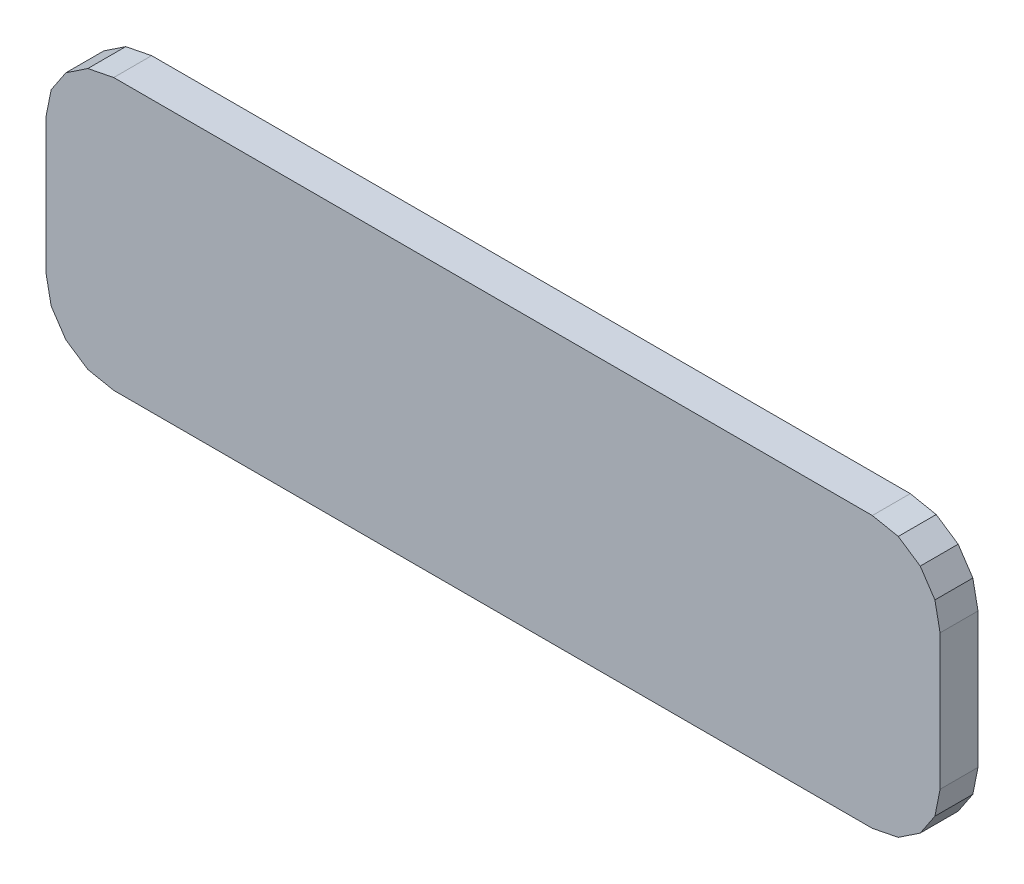
ISO-10303-21;
HEADER;
FILE_DESCRIPTION(('STEP AP214'),'2;1');
FILE_NAME('part.step','',(''),(''),'','','');
FILE_SCHEMA(('AUTOMOTIVE_DESIGN { 1 0 10303 214 1 1 1 1 }'));
ENDSEC;
DATA;
#1=APPLICATION_CONTEXT('core data for automotive mechanical design processes');
#2=APPLICATION_PROTOCOL_DEFINITION('international standard','automotive_design',2000,#1);
#3=PRODUCT_CONTEXT('',#1,'mechanical');
#4=PRODUCT('Part','Part','',(#3));
#5=PRODUCT_RELATED_PRODUCT_CATEGORY('part','',(#4));
#6=PRODUCT_DEFINITION_FORMATION('','',#4);
#7=PRODUCT_DEFINITION_CONTEXT('part definition',#1,'design');
#8=PRODUCT_DEFINITION('design','',#6,#7);
#9=PRODUCT_DEFINITION_SHAPE('','',#8);
#10=(LENGTH_UNIT() NAMED_UNIT(*) SI_UNIT(.MILLI.,.METRE.));
#11=(NAMED_UNIT(*) PLANE_ANGLE_UNIT() SI_UNIT($,.RADIAN.));
#12=(NAMED_UNIT(*) SI_UNIT($,.STERADIAN.) SOLID_ANGLE_UNIT());
#13=UNCERTAINTY_MEASURE_WITH_UNIT(LENGTH_MEASURE(1.E-05),#10,'distance_accuracy_value','');
#14=(GEOMETRIC_REPRESENTATION_CONTEXT(3) GLOBAL_UNCERTAINTY_ASSIGNED_CONTEXT((#13)) GLOBAL_UNIT_ASSIGNED_CONTEXT((#10,
#11,#12)) REPRESENTATION_CONTEXT('',''));
#15=CARTESIAN_POINT('',(0.,0.,0.));
#16=DIRECTION('',(0.,0.,1.));
#17=DIRECTION('',(1.,0.,0.));
#18=AXIS2_PLACEMENT_3D('',#15,#16,#17);
#19=CARTESIAN_POINT('',(85.3875,-110.4,1.635));
#20=DIRECTION('',(0.,0.,-1.));
#21=DIRECTION('',(0.,-1.,0.));
#22=AXIS2_PLACEMENT_3D('',#19,#20,#21);
#23=PLANE('',#22);
#24=DIRECTION('',(0.98078203197939,-0.195106652235078,0.));
#25=VECTOR('',#24,1.);
#26=CARTESIAN_POINT('',(85.7375,-110.275,1.635));
#27=LINE('',#26,#25);
#28=CARTESIAN_POINT('',(85.7375,-110.275,1.635));
#29=VERTEX_POINT('',#28);
#30=CARTESIAN_POINT('',(85.761418,-110.279758,1.635));
#31=VERTEX_POINT('',#30);
#32=EDGE_CURVE('E25',#29,#31,#27,.T.);
#33=ORIENTED_EDGE('',*,*,#32,.F.);
#34=DIRECTION('',(1.,0.,0.));
#35=VECTOR('',#34,1.);
#36=CARTESIAN_POINT('',(85.0375,-110.275,1.635));
#37=LINE('',#36,#35);
#38=CARTESIAN_POINT('',(85.0375,-110.275,1.635));
#39=VERTEX_POINT('',#38);
#40=EDGE_CURVE('E273',#39,#29,#37,.T.);
#41=ORIENTED_EDGE('',*,*,#40,.F.);
#42=DIRECTION('',(0.98078203197939,0.195106652235078,0.));
#43=VECTOR('',#42,1.);
#44=CARTESIAN_POINT('',(85.013582,-110.279758,1.635));
#45=LINE('',#44,#43);
#46=CARTESIAN_POINT('',(85.013582,-110.279758,1.635));
#47=VERTEX_POINT('',#46);
#48=EDGE_CURVE('E267',#47,#39,#45,.T.);
#49=ORIENTED_EDGE('',*,*,#48,.F.);
#50=DIRECTION('',(0.831469424054935,0.555570514751957,0.));
#51=VECTOR('',#50,1.);
#52=CARTESIAN_POINT('',(84.993306,-110.293306,1.635));
#53=LINE('',#52,#51);
#54=CARTESIAN_POINT('',(84.993306,-110.293306,1.635));
#55=VERTEX_POINT('',#54);
#56=EDGE_CURVE('E255',#55,#47,#53,.T.);
#57=ORIENTED_EDGE('',*,*,#56,.F.);
#58=DIRECTION('',(0.555570514751957,0.831469424054935,0.));
#59=VECTOR('',#58,1.);
#60=CARTESIAN_POINT('',(84.979758,-110.313582,1.635));
#61=LINE('',#60,#59);
#62=CARTESIAN_POINT('',(84.979758,-110.313582,1.635));
#63=VERTEX_POINT('',#62);
#64=EDGE_CURVE('E249',#63,#55,#61,.T.);
#65=ORIENTED_EDGE('',*,*,#64,.F.);
#66=DIRECTION('',(0.195106652235078,0.98078203197939,0.));
#67=VECTOR('',#66,1.);
#68=CARTESIAN_POINT('',(84.975,-110.3375,1.635));
#69=LINE('',#68,#67);
#70=CARTESIAN_POINT('',(84.975,-110.3375,1.635));
#71=VERTEX_POINT('',#70);
#72=EDGE_CURVE('E201',#71,#63,#69,.T.);
#73=ORIENTED_EDGE('',*,*,#72,.F.);
#74=DIRECTION('',(0.,1.,0.));
#75=VECTOR('',#74,1.);
#76=CARTESIAN_POINT('',(84.975,-110.4625,1.635));
#77=LINE('',#76,#75);
#78=CARTESIAN_POINT('',(84.975,-110.4625,1.635));
#79=VERTEX_POINT('',#78);
#80=EDGE_CURVE('E195',#79,#71,#77,.T.);
#81=ORIENTED_EDGE('',*,*,#80,.F.);
#82=DIRECTION('',(-0.195106652235078,0.98078203197939,0.));
#83=VECTOR('',#82,1.);
#84=CARTESIAN_POINT('',(84.979758,-110.486418,1.635));
#85=LINE('',#84,#83);
#86=CARTESIAN_POINT('',(84.979758,-110.486418,1.635));
#87=VERTEX_POINT('',#86);
#88=EDGE_CURVE('E198',#87,#79,#85,.T.);
#89=ORIENTED_EDGE('',*,*,#88,.F.);
#90=DIRECTION('',(-0.555570514751957,0.831469424054935,0.));
#91=VECTOR('',#90,1.);
#92=CARTESIAN_POINT('',(84.993306,-110.506694,1.635));
#93=LINE('',#92,#91);
#94=CARTESIAN_POINT('',(84.993306,-110.506694,1.635));
#95=VERTEX_POINT('',#94);
#96=EDGE_CURVE('E354',#95,#87,#93,.T.);
#97=ORIENTED_EDGE('',*,*,#96,.F.);
#98=DIRECTION('',(-0.831469424054935,0.555570514751957,0.));
#99=VECTOR('',#98,1.);
#100=CARTESIAN_POINT('',(85.013582,-110.520242,1.635));
#101=LINE('',#100,#99);
#102=CARTESIAN_POINT('',(85.013582,-110.520242,1.635));
#103=VERTEX_POINT('',#102);
#104=EDGE_CURVE('E323',#103,#95,#101,.T.);
#105=ORIENTED_EDGE('',*,*,#104,.F.);
#106=DIRECTION('',(-0.98078203197939,0.195106652235078,0.));
#107=VECTOR('',#106,1.);
#108=CARTESIAN_POINT('',(85.0375,-110.525,1.635));
#109=LINE('',#108,#107);
#110=CARTESIAN_POINT('',(85.0375,-110.525,1.635));
#111=VERTEX_POINT('',#110);
#112=EDGE_CURVE('E342',#111,#103,#109,.T.);
#113=ORIENTED_EDGE('',*,*,#112,.F.);
#114=DIRECTION('',(-1.,0.,0.));
#115=VECTOR('',#114,1.);
#116=CARTESIAN_POINT('',(85.7375,-110.525,1.635));
#117=LINE('',#116,#115);
#118=CARTESIAN_POINT('',(85.7375,-110.525,1.635));
#119=VERTEX_POINT('',#118);
#120=EDGE_CURVE('E321',#119,#111,#117,.T.);
#121=ORIENTED_EDGE('',*,*,#120,.F.);
#122=DIRECTION('',(-0.98078203197939,-0.195106652235078,0.));
#123=VECTOR('',#122,1.);
#124=CARTESIAN_POINT('',(85.761418,-110.520242,1.635));
#125=LINE('',#124,#123);
#126=CARTESIAN_POINT('',(85.761418,-110.520242,1.635));
#127=VERTEX_POINT('',#126);
#128=EDGE_CURVE('E316',#127,#119,#125,.T.);
#129=ORIENTED_EDGE('',*,*,#128,.F.);
#130=DIRECTION('',(-0.831469424054935,-0.555570514751957,0.));
#131=VECTOR('',#130,1.);
#132=CARTESIAN_POINT('',(85.781694,-110.506694,1.635));
#133=LINE('',#132,#131);
#134=CARTESIAN_POINT('',(85.781694,-110.506694,1.635));
#135=VERTEX_POINT('',#134);
#136=EDGE_CURVE('E304',#135,#127,#133,.T.);
#137=ORIENTED_EDGE('',*,*,#136,.F.);
#138=DIRECTION('',(-0.555570514751957,-0.831469424054935,0.));
#139=VECTOR('',#138,1.);
#140=CARTESIAN_POINT('',(85.795242,-110.486418,1.635));
#141=LINE('',#140,#139);
#142=CARTESIAN_POINT('',(85.795242,-110.486418,1.635));
#143=VERTEX_POINT('',#142);
#144=EDGE_CURVE('E294',#143,#135,#141,.T.);
#145=ORIENTED_EDGE('',*,*,#144,.F.);
#146=DIRECTION('',(-0.195106652235078,-0.98078203197939,0.));
#147=VECTOR('',#146,1.);
#148=CARTESIAN_POINT('',(85.8,-110.4625,1.635));
#149=LINE('',#148,#147);
#150=CARTESIAN_POINT('',(85.8,-110.4625,1.635));
#151=VERTEX_POINT('',#150);
#152=EDGE_CURVE('E403',#151,#143,#149,.T.);
#153=ORIENTED_EDGE('',*,*,#152,.F.);
#154=DIRECTION('',(0.,-1.,0.));
#155=VECTOR('',#154,1.);
#156=CARTESIAN_POINT('',(85.8,-110.3375,1.635));
#157=LINE('',#156,#155);
#158=CARTESIAN_POINT('',(85.8,-110.3375,1.635));
#159=VERTEX_POINT('',#158);
#160=EDGE_CURVE('E392',#159,#151,#157,.T.);
#161=ORIENTED_EDGE('',*,*,#160,.F.);
#162=DIRECTION('',(0.195106652235078,-0.98078203197939,0.));
#163=VECTOR('',#162,1.);
#164=CARTESIAN_POINT('',(85.795242,-110.313582,1.635));
#165=LINE('',#164,#163);
#166=CARTESIAN_POINT('',(85.795242,-110.313582,1.635));
#167=VERTEX_POINT('',#166);
#168=EDGE_CURVE('E435',#167,#159,#165,.T.);
#169=ORIENTED_EDGE('',*,*,#168,.F.);
#170=DIRECTION('',(0.555570514751957,-0.831469424054935,0.));
#171=VECTOR('',#170,1.);
#172=CARTESIAN_POINT('',(85.781694,-110.293306,1.635));
#173=LINE('',#172,#171);
#174=CARTESIAN_POINT('',(85.781694,-110.293306,1.635));
#175=VERTEX_POINT('',#174);
#176=EDGE_CURVE('E424',#175,#167,#173,.T.);
#177=ORIENTED_EDGE('',*,*,#176,.F.);
#178=DIRECTION('',(0.831469424054935,-0.555570514751957,0.));
#179=VECTOR('',#178,1.);
#180=CARTESIAN_POINT('',(85.761418,-110.279758,1.635));
#181=LINE('',#180,#179);
#182=EDGE_CURVE('E456',#31,#175,#181,.T.);
#183=ORIENTED_EDGE('',*,*,#182,.F.);
#184=EDGE_LOOP('',(#33,#41,#49,#57,#65,#73,#81,#89,#97,#105,#113,#121,#129,#137,#145,#153,#161,
#169,#177,#183));
#185=FACE_BOUND('',#184,.T.);
#186=ADVANCED_FACE('F17',(#185),#23,.F.);
#187=CARTESIAN_POINT('',(85.3875,-110.4,1.6));
#188=DIRECTION('',(0.,0.,-1.));
#189=DIRECTION('',(0.,-1.,0.));
#190=AXIS2_PLACEMENT_3D('',#187,#188,#189);
#191=PLANE('',#190);
#192=DIRECTION('',(0.831469424054935,-0.555570514751957,0.));
#193=VECTOR('',#192,1.);
#194=CARTESIAN_POINT('',(85.761418,-110.279758,1.6));
#195=LINE('',#194,#193);
#196=CARTESIAN_POINT('',(85.761418,-110.279758,1.6));
#197=VERTEX_POINT('',#196);
#198=CARTESIAN_POINT('',(85.781694,-110.293306,1.6));
#199=VERTEX_POINT('',#198);
#200=EDGE_CURVE('E429',#197,#199,#195,.T.);
#201=ORIENTED_EDGE('',*,*,#200,.T.);
#202=DIRECTION('',(0.555570514751957,-0.831469424054935,0.));
#203=VECTOR('',#202,1.);
#204=CARTESIAN_POINT('',(85.781694,-110.293306,1.6));
#205=LINE('',#204,#203);
#206=CARTESIAN_POINT('',(85.795242,-110.313582,1.6));
#207=VERTEX_POINT('',#206);
#208=EDGE_CURVE('E432',#199,#207,#205,.T.);
#209=ORIENTED_EDGE('',*,*,#208,.T.);
#210=DIRECTION('',(0.195106652235078,-0.98078203197939,0.));
#211=VECTOR('',#210,1.);
#212=CARTESIAN_POINT('',(85.795242,-110.313582,1.6));
#213=LINE('',#212,#211);
#214=CARTESIAN_POINT('',(85.8,-110.3375,1.6));
#215=VERTEX_POINT('',#214);
#216=EDGE_CURVE('E388',#207,#215,#213,.T.);
#217=ORIENTED_EDGE('',*,*,#216,.T.);
#218=DIRECTION('',(0.,-1.,0.));
#219=VECTOR('',#218,1.);
#220=CARTESIAN_POINT('',(85.8,-110.3375,1.6));
#221=LINE('',#220,#219);
#222=CARTESIAN_POINT('',(85.8,-110.4625,1.6));
#223=VERTEX_POINT('',#222);
#224=EDGE_CURVE('E400',#215,#223,#221,.T.);
#225=ORIENTED_EDGE('',*,*,#224,.T.);
#226=DIRECTION('',(-0.195106652235078,-0.98078203197939,0.));
#227=VECTOR('',#226,1.);
#228=CARTESIAN_POINT('',(85.8,-110.4625,1.6));
#229=LINE('',#228,#227);
#230=CARTESIAN_POINT('',(85.795242,-110.486418,1.6));
#231=VERTEX_POINT('',#230);
#232=EDGE_CURVE('E299',#223,#231,#229,.T.);
#233=ORIENTED_EDGE('',*,*,#232,.T.);
#234=DIRECTION('',(-0.555570514751957,-0.831469424054935,0.));
#235=VECTOR('',#234,1.);
#236=CARTESIAN_POINT('',(85.795242,-110.486418,1.6));
#237=LINE('',#236,#235);
#238=CARTESIAN_POINT('',(85.781694,-110.506694,1.6));
#239=VERTEX_POINT('',#238);
#240=EDGE_CURVE('E303',#231,#239,#237,.T.);
#241=ORIENTED_EDGE('',*,*,#240,.T.);
#242=DIRECTION('',(-0.831469424054935,-0.555570514751957,0.));
#243=VECTOR('',#242,1.);
#244=CARTESIAN_POINT('',(85.781694,-110.506694,1.6));
#245=LINE('',#244,#243);
#246=CARTESIAN_POINT('',(85.761418,-110.520242,1.6));
#247=VERTEX_POINT('',#246);
#248=EDGE_CURVE('E312',#239,#247,#245,.T.);
#249=ORIENTED_EDGE('',*,*,#248,.T.);
#250=DIRECTION('',(-0.98078203197939,-0.195106652235078,0.));
#251=VECTOR('',#250,1.);
#252=CARTESIAN_POINT('',(85.761418,-110.520242,1.6));
#253=LINE('',#252,#251);
#254=CARTESIAN_POINT('',(85.7375,-110.525,1.6));
#255=VERTEX_POINT('',#254);
#256=EDGE_CURVE('E317',#247,#255,#253,.T.);
#257=ORIENTED_EDGE('',*,*,#256,.T.);
#258=DIRECTION('',(-1.,0.,0.));
#259=VECTOR('',#258,1.);
#260=CARTESIAN_POINT('',(85.7375,-110.525,1.6));
#261=LINE('',#260,#259);
#262=CARTESIAN_POINT('',(85.0375,-110.525,1.6));
#263=VERTEX_POINT('',#262);
#264=EDGE_CURVE('E338',#255,#263,#261,.T.);
#265=ORIENTED_EDGE('',*,*,#264,.T.);
#266=DIRECTION('',(-0.98078203197939,0.195106652235078,0.));
#267=VECTOR('',#266,1.);
#268=CARTESIAN_POINT('',(85.0375,-110.525,1.6));
#269=LINE('',#268,#267);
#270=CARTESIAN_POINT('',(85.013582,-110.520242,1.6));
#271=VERTEX_POINT('',#270);
#272=EDGE_CURVE('E328',#263,#271,#269,.T.);
#273=ORIENTED_EDGE('',*,*,#272,.T.);
#274=DIRECTION('',(-0.831469424054935,0.555570514751957,0.));
#275=VECTOR('',#274,1.);
#276=CARTESIAN_POINT('',(85.013582,-110.520242,1.6));
#277=LINE('',#276,#275);
#278=CARTESIAN_POINT('',(84.993306,-110.506694,1.6));
#279=VERTEX_POINT('',#278);
#280=EDGE_CURVE('E353',#271,#279,#277,.T.);
#281=ORIENTED_EDGE('',*,*,#280,.T.);
#282=DIRECTION('',(-0.555570514751957,0.831469424054935,0.));
#283=VECTOR('',#282,1.);
#284=CARTESIAN_POINT('',(84.993306,-110.506694,1.6));
#285=LINE('',#284,#283);
#286=CARTESIAN_POINT('',(84.979758,-110.486418,1.6));
#287=VERTEX_POINT('',#286);
#288=EDGE_CURVE('E223',#279,#287,#285,.T.);
#289=ORIENTED_EDGE('',*,*,#288,.T.);
#290=DIRECTION('',(-0.195106652235078,0.98078203197939,0.));
#291=VECTOR('',#290,1.);
#292=CARTESIAN_POINT('',(84.979758,-110.486418,1.6));
#293=LINE('',#292,#291);
#294=CARTESIAN_POINT('',(84.975,-110.4625,1.6));
#295=VERTEX_POINT('',#294);
#296=EDGE_CURVE('E207',#287,#295,#293,.T.);
#297=ORIENTED_EDGE('',*,*,#296,.T.);
#298=DIRECTION('',(0.,1.,0.));
#299=VECTOR('',#298,1.);
#300=CARTESIAN_POINT('',(84.975,-110.4625,1.6));
#301=LINE('',#300,#299);
#302=CARTESIAN_POINT('',(84.975,-110.3375,1.6));
#303=VERTEX_POINT('',#302);
#304=EDGE_CURVE('E213',#295,#303,#301,.T.);
#305=ORIENTED_EDGE('',*,*,#304,.T.);
#306=DIRECTION('',(0.195106652235078,0.98078203197939,0.));
#307=VECTOR('',#306,1.);
#308=CARTESIAN_POINT('',(84.975,-110.3375,1.6));
#309=LINE('',#308,#307);
#310=CARTESIAN_POINT('',(84.979758,-110.313582,1.6));
#311=VERTEX_POINT('',#310);
#312=EDGE_CURVE('E245',#303,#311,#309,.T.);
#313=ORIENTED_EDGE('',*,*,#312,.T.);
#314=DIRECTION('',(0.555570514751957,0.831469424054935,0.));
#315=VECTOR('',#314,1.);
#316=CARTESIAN_POINT('',(84.979758,-110.313582,1.6));
#317=LINE('',#316,#315);
#318=CARTESIAN_POINT('',(84.993306,-110.293306,1.6));
#319=VERTEX_POINT('',#318);
#320=EDGE_CURVE('E254',#311,#319,#317,.T.);
#321=ORIENTED_EDGE('',*,*,#320,.T.);
#322=DIRECTION('',(0.831469424054935,0.555570514751957,0.));
#323=VECTOR('',#322,1.);
#324=CARTESIAN_POINT('',(84.993306,-110.293306,1.6));
#325=LINE('',#324,#323);
#326=CARTESIAN_POINT('',(85.013582,-110.279758,1.6));
#327=VERTEX_POINT('',#326);
#328=EDGE_CURVE('E263',#319,#327,#325,.T.);
#329=ORIENTED_EDGE('',*,*,#328,.T.);
#330=DIRECTION('',(0.98078203197939,0.195106652235078,0.));
#331=VECTOR('',#330,1.);
#332=CARTESIAN_POINT('',(85.013582,-110.279758,1.6));
#333=LINE('',#332,#331);
#334=CARTESIAN_POINT('',(85.0375,-110.275,1.6));
#335=VERTEX_POINT('',#334);
#336=EDGE_CURVE('E272',#327,#335,#333,.T.);
#337=ORIENTED_EDGE('',*,*,#336,.T.);
#338=DIRECTION('',(1.,0.,0.));
#339=VECTOR('',#338,1.);
#340=CARTESIAN_POINT('',(85.0375,-110.275,1.6));
#341=LINE('',#340,#339);
#342=CARTESIAN_POINT('',(85.7375,-110.275,1.6));
#343=VERTEX_POINT('',#342);
#344=EDGE_CURVE('E279',#335,#343,#341,.T.);
#345=ORIENTED_EDGE('',*,*,#344,.T.);
#346=DIRECTION('',(0.98078203197939,-0.195106652235078,0.));
#347=VECTOR('',#346,1.);
#348=CARTESIAN_POINT('',(85.7375,-110.275,1.6));
#349=LINE('',#348,#347);
#350=EDGE_CURVE('E11',#343,#197,#349,.T.);
#351=ORIENTED_EDGE('',*,*,#350,.T.);
#352=EDGE_LOOP('',(#201,#209,#217,#225,#233,#241,#249,#257,#265,#273,#281,#289,#297,#305,#313,
#321,#329,#337,#345,#351));
#353=FACE_BOUND('',#352,.T.);
#354=ADVANCED_FACE('F369',(#353),#191,.T.);
#355=CARTESIAN_POINT('',(85.7375,-110.275,1.6));
#356=DIRECTION('',(0.195106652235078,0.98078203197939,0.));
#357=DIRECTION('',(0.,0.,-1.));
#358=AXIS2_PLACEMENT_3D('',#355,#356,#357);
#359=PLANE('',#358);
#360=DIRECTION('',(0.,0.,1.));
#361=VECTOR('',#360,1.);
#362=CARTESIAN_POINT('',(85.7375,-110.275,1.6));
#363=LINE('',#362,#361);
#364=EDGE_CURVE('E277',#343,#29,#363,.T.);
#365=ORIENTED_EDGE('',*,*,#364,.T.);
#366=ORIENTED_EDGE('',*,*,#32,.T.);
#367=DIRECTION('',(0.,0.,1.));
#368=VECTOR('',#367,1.);
#369=CARTESIAN_POINT('',(85.761418,-110.279758,1.6));
#370=LINE('',#369,#368);
#371=EDGE_CURVE('E452',#197,#31,#370,.T.);
#372=ORIENTED_EDGE('',*,*,#371,.F.);
#373=ORIENTED_EDGE('',*,*,#350,.F.);
#374=EDGE_LOOP('',(#365,#366,#372,#373));
#375=FACE_BOUND('',#374,.T.);
#376=ADVANCED_FACE('F570',(#375),#359,.T.);
#377=CARTESIAN_POINT('',(85.0375,-110.275,1.6));
#378=DIRECTION('',(0.,1.,0.));
#379=DIRECTION('',(1.,0.,0.));
#380=AXIS2_PLACEMENT_3D('',#377,#378,#379);
#381=PLANE('',#380);
#382=DIRECTION('',(0.,0.,1.));
#383=VECTOR('',#382,1.);
#384=CARTESIAN_POINT('',(85.0375,-110.275,1.6));
#385=LINE('',#384,#383);
#386=EDGE_CURVE('E268',#335,#39,#385,.T.);
#387=ORIENTED_EDGE('',*,*,#386,.T.);
#388=ORIENTED_EDGE('',*,*,#40,.T.);
#389=ORIENTED_EDGE('',*,*,#364,.F.);
#390=ORIENTED_EDGE('',*,*,#344,.F.);
#391=EDGE_LOOP('',(#387,#388,#389,#390));
#392=FACE_BOUND('',#391,.T.);
#393=ADVANCED_FACE('F367',(#392),#381,.T.);
#394=CARTESIAN_POINT('',(85.013582,-110.279758,1.6));
#395=DIRECTION('',(-0.195106652235078,0.98078203197939,0.));
#396=DIRECTION('',(0.,0.,1.));
#397=AXIS2_PLACEMENT_3D('',#394,#395,#396);
#398=PLANE('',#397);
#399=DIRECTION('',(0.,0.,1.));
#400=VECTOR('',#399,1.);
#401=CARTESIAN_POINT('',(85.013582,-110.279758,1.6));
#402=LINE('',#401,#400);
#403=EDGE_CURVE('E259',#327,#47,#402,.T.);
#404=ORIENTED_EDGE('',*,*,#403,.T.);
#405=ORIENTED_EDGE('',*,*,#48,.T.);
#406=ORIENTED_EDGE('',*,*,#386,.F.);
#407=ORIENTED_EDGE('',*,*,#336,.F.);
#408=EDGE_LOOP('',(#404,#405,#406,#407));
#409=FACE_BOUND('',#408,.T.);
#410=ADVANCED_FACE('F364',(#409),#398,.T.);
#411=CARTESIAN_POINT('',(84.993306,-110.293306,1.6));
#412=DIRECTION('',(-0.555570514751957,0.831469424054935,0.));
#413=DIRECTION('',(0.,0.,1.));
#414=AXIS2_PLACEMENT_3D('',#411,#412,#413);
#415=PLANE('',#414);
#416=DIRECTION('',(0.,0.,1.));
#417=VECTOR('',#416,1.);
#418=CARTESIAN_POINT('',(84.993306,-110.293306,1.6));
#419=LINE('',#418,#417);
#420=EDGE_CURVE('E250',#319,#55,#419,.T.);
#421=ORIENTED_EDGE('',*,*,#420,.T.);
#422=ORIENTED_EDGE('',*,*,#56,.T.);
#423=ORIENTED_EDGE('',*,*,#403,.F.);
#424=ORIENTED_EDGE('',*,*,#328,.F.);
#425=EDGE_LOOP('',(#421,#422,#423,#424));
#426=FACE_BOUND('',#425,.T.);
#427=ADVANCED_FACE('F372',(#426),#415,.T.);
#428=CARTESIAN_POINT('',(84.979758,-110.313582,1.6));
#429=DIRECTION('',(-0.831469424054935,0.555570514751957,0.));
#430=DIRECTION('',(0.,0.,1.));
#431=AXIS2_PLACEMENT_3D('',#428,#429,#430);
#432=PLANE('',#431);
#433=DIRECTION('',(0.,0.,1.));
#434=VECTOR('',#433,1.);
#435=CARTESIAN_POINT('',(84.979758,-110.313582,1.6));
#436=LINE('',#435,#434);
#437=EDGE_CURVE('E241',#311,#63,#436,.T.);
#438=ORIENTED_EDGE('',*,*,#437,.T.);
#439=ORIENTED_EDGE('',*,*,#64,.T.);
#440=ORIENTED_EDGE('',*,*,#420,.F.);
#441=ORIENTED_EDGE('',*,*,#320,.F.);
#442=EDGE_LOOP('',(#438,#439,#440,#441));
#443=FACE_BOUND('',#442,.T.);
#444=ADVANCED_FACE('F375',(#443),#432,.T.);
#445=CARTESIAN_POINT('',(84.975,-110.3375,1.6));
#446=DIRECTION('',(-0.98078203197939,0.195106652235078,0.));
#447=DIRECTION('',(0.,0.,1.));
#448=AXIS2_PLACEMENT_3D('',#445,#446,#447);
#449=PLANE('',#448);
#450=DIRECTION('',(0.,0.,1.));
#451=VECTOR('',#450,1.);
#452=CARTESIAN_POINT('',(84.975,-110.3375,1.6));
#453=LINE('',#452,#451);
#454=EDGE_CURVE('E206',#303,#71,#453,.T.);
#455=ORIENTED_EDGE('',*,*,#454,.T.);
#456=ORIENTED_EDGE('',*,*,#72,.T.);
#457=ORIENTED_EDGE('',*,*,#437,.F.);
#458=ORIENTED_EDGE('',*,*,#312,.F.);
#459=EDGE_LOOP('',(#455,#456,#457,#458));
#460=FACE_BOUND('',#459,.T.);
#461=ADVANCED_FACE('F606',(#460),#449,.T.);
#462=CARTESIAN_POINT('',(84.975,-110.4625,1.6));
#463=DIRECTION('',(-1.,0.,0.));
#464=DIRECTION('',(0.,0.,1.));
#465=AXIS2_PLACEMENT_3D('',#462,#463,#464);
#466=PLANE('',#465);
#467=DIRECTION('',(0.,0.,1.));
#468=VECTOR('',#467,1.);
#469=CARTESIAN_POINT('',(84.975,-110.4625,1.6));
#470=LINE('',#469,#468);
#471=EDGE_CURVE('E210',#295,#79,#470,.T.);
#472=ORIENTED_EDGE('',*,*,#471,.T.);
#473=ORIENTED_EDGE('',*,*,#80,.T.);
#474=ORIENTED_EDGE('',*,*,#454,.F.);
#475=ORIENTED_EDGE('',*,*,#304,.F.);
#476=EDGE_LOOP('',(#472,#473,#474,#475));
#477=FACE_BOUND('',#476,.T.);
#478=ADVANCED_FACE('F211',(#477),#466,.T.);
#479=CARTESIAN_POINT('',(84.979758,-110.486418,1.6));
#480=DIRECTION('',(-0.98078203197939,-0.195106652235078,0.));
#481=DIRECTION('',(-0.195106652235078,0.98078203197939,0.));
#482=AXIS2_PLACEMENT_3D('',#479,#480,#481);
#483=PLANE('',#482);
#484=DIRECTION('',(0.,0.,1.));
#485=VECTOR('',#484,1.);
#486=CARTESIAN_POINT('',(84.979758,-110.486418,1.6));
#487=LINE('',#486,#485);
#488=EDGE_CURVE('E220',#287,#87,#487,.T.);
#489=ORIENTED_EDGE('',*,*,#488,.T.);
#490=ORIENTED_EDGE('',*,*,#88,.T.);
#491=ORIENTED_EDGE('',*,*,#471,.F.);
#492=ORIENTED_EDGE('',*,*,#296,.F.);
#493=EDGE_LOOP('',(#489,#490,#491,#492));
#494=FACE_BOUND('',#493,.T.);
#495=ADVANCED_FACE('F218',(#494),#483,.T.);
#496=CARTESIAN_POINT('',(84.993306,-110.506694,1.6));
#497=DIRECTION('',(-0.831469424054935,-0.555570514751957,0.));
#498=DIRECTION('',(-0.555570514751957,0.831469424054935,0.));
#499=AXIS2_PLACEMENT_3D('',#496,#497,#498);
#500=PLANE('',#499);
#501=DIRECTION('',(0.,0.,1.));
#502=VECTOR('',#501,1.);
#503=CARTESIAN_POINT('',(84.993306,-110.506694,1.6));
#504=LINE('',#503,#502);
#505=EDGE_CURVE('E327',#279,#95,#504,.T.);
#506=ORIENTED_EDGE('',*,*,#505,.T.);
#507=ORIENTED_EDGE('',*,*,#96,.T.);
#508=ORIENTED_EDGE('',*,*,#488,.F.);
#509=ORIENTED_EDGE('',*,*,#288,.F.);
#510=EDGE_LOOP('',(#506,#507,#508,#509));
#511=FACE_BOUND('',#510,.T.);
#512=ADVANCED_FACE('F584',(#511),#500,.T.);
#513=CARTESIAN_POINT('',(85.013582,-110.520242,1.6));
#514=DIRECTION('',(-0.555570514751957,-0.831469424054935,0.));
#515=DIRECTION('',(-0.831469424054935,0.555570514751957,0.));
#516=AXIS2_PLACEMENT_3D('',#513,#514,#515);
#517=PLANE('',#516);
#518=DIRECTION('',(0.,0.,1.));
#519=VECTOR('',#518,1.);
#520=CARTESIAN_POINT('',(85.013582,-110.520242,1.6));
#521=LINE('',#520,#519);
#522=EDGE_CURVE('E346',#271,#103,#521,.T.);
#523=ORIENTED_EDGE('',*,*,#522,.T.);
#524=ORIENTED_EDGE('',*,*,#104,.T.);
#525=ORIENTED_EDGE('',*,*,#505,.F.);
#526=ORIENTED_EDGE('',*,*,#280,.F.);
#527=EDGE_LOOP('',(#523,#524,#525,#526));
#528=FACE_BOUND('',#527,.T.);
#529=ADVANCED_FACE('F587',(#528),#517,.T.);
#530=CARTESIAN_POINT('',(85.0375,-110.525,1.6));
#531=DIRECTION('',(-0.195106652235078,-0.98078203197939,0.));
#532=DIRECTION('',(-0.98078203197939,0.195106652235078,0.));
#533=AXIS2_PLACEMENT_3D('',#530,#531,#532);
#534=PLANE('',#533);
#535=DIRECTION('',(0.,0.,1.));
#536=VECTOR('',#535,1.);
#537=CARTESIAN_POINT('',(85.0375,-110.525,1.6));
#538=LINE('',#537,#536);
#539=EDGE_CURVE('E332',#263,#111,#538,.T.);
#540=ORIENTED_EDGE('',*,*,#539,.T.);
#541=ORIENTED_EDGE('',*,*,#112,.T.);
#542=ORIENTED_EDGE('',*,*,#522,.F.);
#543=ORIENTED_EDGE('',*,*,#272,.F.);
#544=EDGE_LOOP('',(#540,#541,#542,#543));
#545=FACE_BOUND('',#544,.T.);
#546=ADVANCED_FACE('F591',(#545),#534,.T.);
#547=CARTESIAN_POINT('',(85.7375,-110.525,1.6));
#548=DIRECTION('',(0.,-1.,0.));
#549=DIRECTION('',(0.,0.,-1.));
#550=AXIS2_PLACEMENT_3D('',#547,#548,#549);
#551=PLANE('',#550);
#552=DIRECTION('',(0.,0.,1.));
#553=VECTOR('',#552,1.);
#554=CARTESIAN_POINT('',(85.7375,-110.525,1.6));
#555=LINE('',#554,#553);
#556=EDGE_CURVE('E322',#255,#119,#555,.T.);
#557=ORIENTED_EDGE('',*,*,#556,.T.);
#558=ORIENTED_EDGE('',*,*,#120,.T.);
#559=ORIENTED_EDGE('',*,*,#539,.F.);
#560=ORIENTED_EDGE('',*,*,#264,.F.);
#561=EDGE_LOOP('',(#557,#558,#559,#560));
#562=FACE_BOUND('',#561,.T.);
#563=ADVANCED_FACE('F589',(#562),#551,.T.);
#564=CARTESIAN_POINT('',(85.761418,-110.520242,1.6));
#565=DIRECTION('',(0.195106652235078,-0.98078203197939,0.));
#566=DIRECTION('',(0.,0.,-1.));
#567=AXIS2_PLACEMENT_3D('',#564,#565,#566);
#568=PLANE('',#567);
#569=DIRECTION('',(0.,0.,1.));
#570=VECTOR('',#569,1.);
#571=CARTESIAN_POINT('',(85.761418,-110.520242,1.6));
#572=LINE('',#571,#570);
#573=EDGE_CURVE('E308',#247,#127,#572,.T.);
#574=ORIENTED_EDGE('',*,*,#573,.T.);
#575=ORIENTED_EDGE('',*,*,#128,.T.);
#576=ORIENTED_EDGE('',*,*,#556,.F.);
#577=ORIENTED_EDGE('',*,*,#256,.F.);
#578=EDGE_LOOP('',(#574,#575,#576,#577));
#579=FACE_BOUND('',#578,.T.);
#580=ADVANCED_FACE('F411',(#579),#568,.T.);
#581=CARTESIAN_POINT('',(85.781694,-110.506694,1.6));
#582=DIRECTION('',(0.555570514751957,-0.831469424054935,0.));
#583=DIRECTION('',(0.,0.,-1.));
#584=AXIS2_PLACEMENT_3D('',#581,#582,#583);
#585=PLANE('',#584);
#586=DIRECTION('',(0.,0.,1.));
#587=VECTOR('',#586,1.);
#588=CARTESIAN_POINT('',(85.781694,-110.506694,1.6));
#589=LINE('',#588,#587);
#590=EDGE_CURVE('E298',#239,#135,#589,.T.);
#591=ORIENTED_EDGE('',*,*,#590,.T.);
#592=ORIENTED_EDGE('',*,*,#136,.T.);
#593=ORIENTED_EDGE('',*,*,#573,.F.);
#594=ORIENTED_EDGE('',*,*,#248,.F.);
#595=EDGE_LOOP('',(#591,#592,#593,#594));
#596=FACE_BOUND('',#595,.T.);
#597=ADVANCED_FACE('F414',(#596),#585,.T.);
#598=CARTESIAN_POINT('',(85.795242,-110.486418,1.6));
#599=DIRECTION('',(0.831469424054935,-0.555570514751957,0.));
#600=DIRECTION('',(0.,0.,-1.));
#601=AXIS2_PLACEMENT_3D('',#598,#599,#600);
#602=PLANE('',#601);
#603=DIRECTION('',(0.,0.,1.));
#604=VECTOR('',#603,1.);
#605=CARTESIAN_POINT('',(85.795242,-110.486418,1.6));
#606=LINE('',#605,#604);
#607=EDGE_CURVE('E292',#231,#143,#606,.T.);
#608=ORIENTED_EDGE('',*,*,#607,.T.);
#609=ORIENTED_EDGE('',*,*,#144,.T.);
#610=ORIENTED_EDGE('',*,*,#590,.F.);
#611=ORIENTED_EDGE('',*,*,#240,.F.);
#612=EDGE_LOOP('',(#608,#609,#610,#611));
#613=FACE_BOUND('',#612,.T.);
#614=ADVANCED_FACE('F550',(#613),#602,.T.);
#615=CARTESIAN_POINT('',(85.8,-110.4625,1.6));
#616=DIRECTION('',(0.98078203197939,-0.195106652235078,0.));
#617=DIRECTION('',(0.,0.,-1.));
#618=AXIS2_PLACEMENT_3D('',#615,#616,#617);
#619=PLANE('',#618);
#620=DIRECTION('',(0.,0.,1.));
#621=VECTOR('',#620,1.);
#622=CARTESIAN_POINT('',(85.8,-110.4625,1.6));
#623=LINE('',#622,#621);
#624=EDGE_CURVE('E396',#223,#151,#623,.T.);
#625=ORIENTED_EDGE('',*,*,#624,.T.);
#626=ORIENTED_EDGE('',*,*,#152,.T.);
#627=ORIENTED_EDGE('',*,*,#607,.F.);
#628=ORIENTED_EDGE('',*,*,#232,.F.);
#629=EDGE_LOOP('',(#625,#626,#627,#628));
#630=FACE_BOUND('',#629,.T.);
#631=ADVANCED_FACE('F552',(#630),#619,.T.);
#632=CARTESIAN_POINT('',(85.8,-110.3375,1.6));
#633=DIRECTION('',(1.,0.,0.));
#634=DIRECTION('',(0.,1.,0.));
#635=AXIS2_PLACEMENT_3D('',#632,#633,#634);
#636=PLANE('',#635);
#637=DIRECTION('',(0.,0.,1.));
#638=VECTOR('',#637,1.);
#639=CARTESIAN_POINT('',(85.8,-110.3375,1.6));
#640=LINE('',#639,#638);
#641=EDGE_CURVE('E383',#215,#159,#640,.T.);
#642=ORIENTED_EDGE('',*,*,#641,.T.);
#643=ORIENTED_EDGE('',*,*,#160,.T.);
#644=ORIENTED_EDGE('',*,*,#624,.F.);
#645=ORIENTED_EDGE('',*,*,#224,.F.);
#646=EDGE_LOOP('',(#642,#643,#644,#645));
#647=FACE_BOUND('',#646,.T.);
#648=ADVANCED_FACE('F554',(#647),#636,.T.);
#649=CARTESIAN_POINT('',(85.795242,-110.313582,1.6));
#650=DIRECTION('',(0.98078203197939,0.195106652235078,0.));
#651=DIRECTION('',(0.,0.,-1.));
#652=AXIS2_PLACEMENT_3D('',#649,#650,#651);
#653=PLANE('',#652);
#654=DIRECTION('',(0.,0.,1.));
#655=VECTOR('',#654,1.);
#656=CARTESIAN_POINT('',(85.795242,-110.313582,1.6));
#657=LINE('',#656,#655);
#658=EDGE_CURVE('E428',#207,#167,#657,.T.);
#659=ORIENTED_EDGE('',*,*,#658,.T.);
#660=ORIENTED_EDGE('',*,*,#168,.T.);
#661=ORIENTED_EDGE('',*,*,#641,.F.);
#662=ORIENTED_EDGE('',*,*,#216,.F.);
#663=EDGE_LOOP('',(#659,#660,#661,#662));
#664=FACE_BOUND('',#663,.T.);
#665=ADVANCED_FACE('F480',(#664),#653,.T.);
#666=CARTESIAN_POINT('',(85.781694,-110.293306,1.6));
#667=DIRECTION('',(0.831469424054935,0.555570514751957,0.));
#668=DIRECTION('',(0.,0.,-1.));
#669=AXIS2_PLACEMENT_3D('',#666,#667,#668);
#670=PLANE('',#669);
#671=DIRECTION('',(0.,0.,1.));
#672=VECTOR('',#671,1.);
#673=CARTESIAN_POINT('',(85.781694,-110.293306,1.6));
#674=LINE('',#673,#672);
#675=EDGE_CURVE('E460',#199,#175,#674,.T.);
#676=ORIENTED_EDGE('',*,*,#675,.T.);
#677=ORIENTED_EDGE('',*,*,#176,.T.);
#678=ORIENTED_EDGE('',*,*,#658,.F.);
#679=ORIENTED_EDGE('',*,*,#208,.F.);
#680=EDGE_LOOP('',(#676,#677,#678,#679));
#681=FACE_BOUND('',#680,.T.);
#682=ADVANCED_FACE('F477',(#681),#670,.T.);
#683=CARTESIAN_POINT('',(85.761418,-110.279758,1.6));
#684=DIRECTION('',(0.555570514751957,0.831469424054935,0.));
#685=DIRECTION('',(0.,0.,-1.));
#686=AXIS2_PLACEMENT_3D('',#683,#684,#685);
#687=PLANE('',#686);
#688=ORIENTED_EDGE('',*,*,#371,.T.);
#689=ORIENTED_EDGE('',*,*,#182,.T.);
#690=ORIENTED_EDGE('',*,*,#675,.F.);
#691=ORIENTED_EDGE('',*,*,#200,.F.);
#692=EDGE_LOOP('',(#688,#689,#690,#691));
#693=FACE_BOUND('',#692,.T.);
#694=ADVANCED_FACE('F475',(#693),#687,.T.);
#695=CLOSED_SHELL('',(#186,#354,#376,#393,#410,#427,#444,#461,#478,#495,#512,#529,#546,#563,
#580,#597,#614,#631,#648,#665,#682,#694));
#696=MANIFOLD_SOLID_BREP('B1',#695);
#697=ADVANCED_BREP_SHAPE_REPRESENTATION('',(#18,#696),#14);
#698=SHAPE_DEFINITION_REPRESENTATION(#9,#697);
ENDSEC;
END-ISO-10303-21;
